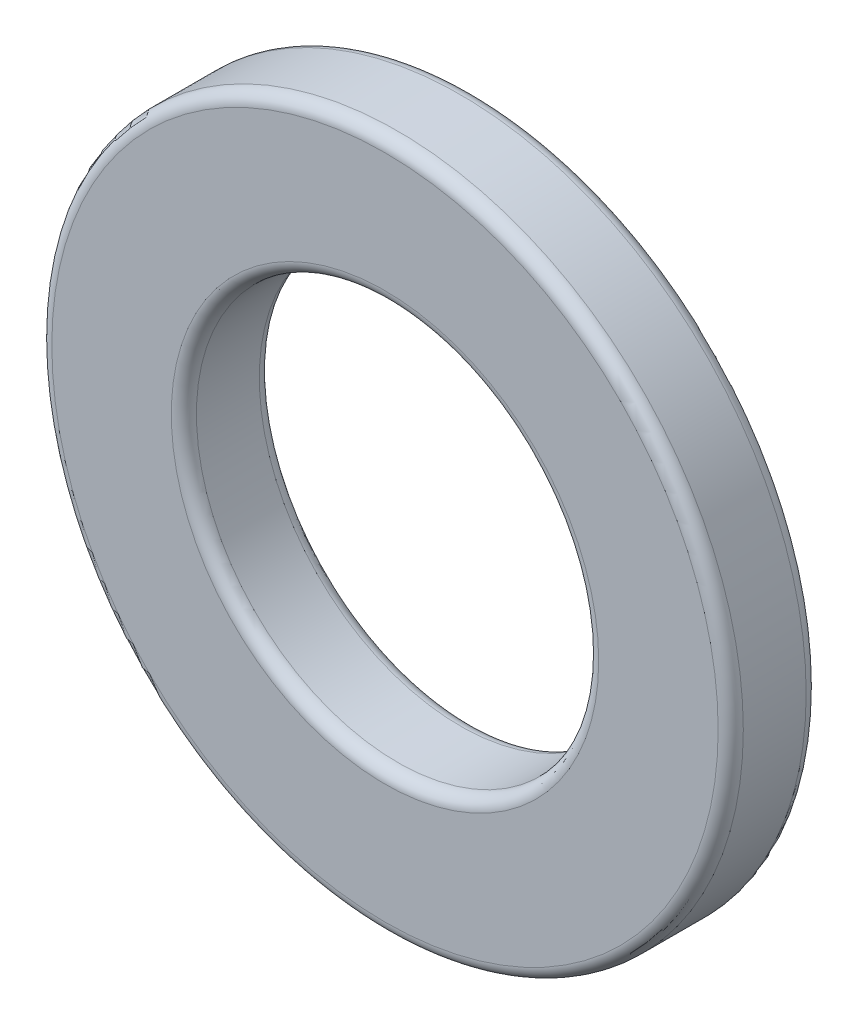
ISO-10303-21;
HEADER;
FILE_DESCRIPTION(('STEP AP214'),'2;1');
FILE_NAME('part.step','',(''),(''),'','','');
FILE_SCHEMA(('AUTOMOTIVE_DESIGN { 1 0 10303 214 1 1 1 1 }'));
ENDSEC;
DATA;
#1=APPLICATION_CONTEXT('core data for automotive mechanical design processes');
#2=APPLICATION_PROTOCOL_DEFINITION('international standard','automotive_design',2000,#1);
#3=PRODUCT_CONTEXT('',#1,'mechanical');
#4=PRODUCT('Part','Part','',(#3));
#5=PRODUCT_RELATED_PRODUCT_CATEGORY('part','',(#4));
#6=PRODUCT_DEFINITION_FORMATION('','',#4);
#7=PRODUCT_DEFINITION_CONTEXT('part definition',#1,'design');
#8=PRODUCT_DEFINITION('design','',#6,#7);
#9=PRODUCT_DEFINITION_SHAPE('','',#8);
#10=(LENGTH_UNIT() NAMED_UNIT(*) SI_UNIT(.MILLI.,.METRE.));
#11=(NAMED_UNIT(*) PLANE_ANGLE_UNIT() SI_UNIT($,.RADIAN.));
#12=(NAMED_UNIT(*) SI_UNIT($,.STERADIAN.) SOLID_ANGLE_UNIT());
#13=UNCERTAINTY_MEASURE_WITH_UNIT(LENGTH_MEASURE(1.E-05),#10,'distance_accuracy_value','');
#14=(GEOMETRIC_REPRESENTATION_CONTEXT(3) GLOBAL_UNCERTAINTY_ASSIGNED_CONTEXT((#13)) GLOBAL_UNIT_ASSIGNED_CONTEXT((#10,
#11,#12)) REPRESENTATION_CONTEXT('',''));
#15=CARTESIAN_POINT('',(0.,0.,0.));
#16=DIRECTION('',(0.,0.,1.));
#17=DIRECTION('',(1.,0.,0.));
#18=AXIS2_PLACEMENT_3D('',#15,#16,#17);
#19=CARTESIAN_POINT('',(0.,0.,0.35));
#20=DIRECTION('',(0.,0.,1.));
#21=DIRECTION('',(1.,0.,0.));
#22=AXIS2_PLACEMENT_3D('',#19,#20,#21);
#23=PLANE('',#22);
#24=CARTESIAN_POINT('',(0.,0.,0.35));
#25=DIRECTION('',(0.,0.,1.));
#26=DIRECTION('',(1.,0.,0.));
#27=AXIS2_PLACEMENT_3D('',#24,#25,#26);
#28=CIRCLE('',#27,0.85);
#29=CARTESIAN_POINT('',(0.85,0.,0.35));
#30=VERTEX_POINT('',#29);
#31=EDGE_CURVE('E51',#30,#30,#28,.F.);
#32=ORIENTED_EDGE('',*,*,#31,.T.);
#33=EDGE_LOOP('',(#32));
#34=FACE_BOUND('',#33,.T.);
#35=CARTESIAN_POINT('',(0.,0.,0.35));
#36=DIRECTION('',(0.,0.,1.));
#37=DIRECTION('',(1.,0.,0.));
#38=AXIS2_PLACEMENT_3D('',#35,#36,#37);
#39=CIRCLE('',#38,1.325);
#40=CARTESIAN_POINT('',(1.325,0.,0.35));
#41=VERTEX_POINT('',#40);
#42=EDGE_CURVE('E54',#41,#41,#39,.T.);
#43=ORIENTED_EDGE('',*,*,#42,.T.);
#44=EDGE_LOOP('',(#43));
#45=FACE_BOUND('',#44,.T.);
#46=ADVANCED_FACE('F31',(#34,#45),#23,.T.);
#47=CARTESIAN_POINT('',(0.,0.,0.));
#48=DIRECTION('',(0.,0.,1.));
#49=DIRECTION('',(1.,0.,0.));
#50=AXIS2_PLACEMENT_3D('',#47,#48,#49);
#51=PLANE('',#50);
#52=CARTESIAN_POINT('',(0.,0.,0.));
#53=DIRECTION('',(0.,0.,1.));
#54=DIRECTION('',(1.,0.,0.));
#55=AXIS2_PLACEMENT_3D('',#52,#53,#54);
#56=CIRCLE('',#55,0.85);
#57=CARTESIAN_POINT('',(0.85,0.,0.));
#58=VERTEX_POINT('',#57);
#59=EDGE_CURVE('E10',#58,#58,#56,.T.);
#60=ORIENTED_EDGE('',*,*,#59,.T.);
#61=EDGE_LOOP('',(#60));
#62=FACE_BOUND('',#61,.T.);
#63=CARTESIAN_POINT('',(0.,0.,0.));
#64=DIRECTION('',(0.,0.,1.));
#65=DIRECTION('',(1.,0.,0.));
#66=AXIS2_PLACEMENT_3D('',#63,#64,#65);
#67=CIRCLE('',#66,1.325);
#68=CARTESIAN_POINT('',(1.325,0.,0.));
#69=VERTEX_POINT('',#68);
#70=EDGE_CURVE('E38',#69,#69,#67,.F.);
#71=ORIENTED_EDGE('',*,*,#70,.T.);
#72=EDGE_LOOP('',(#71));
#73=FACE_BOUND('',#72,.T.);
#74=ADVANCED_FACE('F79',(#62,#73),#51,.F.);
#75=CARTESIAN_POINT('',(0.,0.,0.35));
#76=DIRECTION('',(0.,0.,-1.));
#77=DIRECTION('',(-1.,0.,0.));
#78=AXIS2_PLACEMENT_3D('',#75,#76,#77);
#79=CYLINDRICAL_SURFACE('',#78,1.375);
#80=CARTESIAN_POINT('',(0.,0.,0.3));
#81=DIRECTION('',(0.,0.,1.));
#82=DIRECTION('',(1.,0.,0.));
#83=AXIS2_PLACEMENT_3D('',#80,#81,#82);
#84=CIRCLE('',#83,1.375);
#85=CARTESIAN_POINT('',(1.375,0.,0.3));
#86=VERTEX_POINT('',#85);
#87=EDGE_CURVE('E42',#86,#86,#84,.F.);
#88=ORIENTED_EDGE('',*,*,#87,.T.);
#89=EDGE_LOOP('',(#88));
#90=FACE_BOUND('',#89,.T.);
#91=CARTESIAN_POINT('',(0.,0.,0.05));
#92=DIRECTION('',(0.,0.,1.));
#93=DIRECTION('',(1.,0.,0.));
#94=AXIS2_PLACEMENT_3D('',#91,#92,#93);
#95=CIRCLE('',#94,1.375);
#96=CARTESIAN_POINT('',(1.375,0.,0.05));
#97=VERTEX_POINT('',#96);
#98=EDGE_CURVE('E46',#97,#97,#95,.T.);
#99=ORIENTED_EDGE('',*,*,#98,.T.);
#100=EDGE_LOOP('',(#99));
#101=FACE_BOUND('',#100,.T.);
#102=ADVANCED_FACE('F85',(#90,#101),#79,.T.);
#103=CARTESIAN_POINT('',(0.,0.,0.35));
#104=DIRECTION('',(0.,0.,-1.));
#105=DIRECTION('',(-1.,0.,0.));
#106=AXIS2_PLACEMENT_3D('',#103,#104,#105);
#107=CYLINDRICAL_SURFACE('',#106,0.8);
#108=CARTESIAN_POINT('',(0.,0.,0.3));
#109=DIRECTION('',(0.,0.,1.));
#110=DIRECTION('',(1.,0.,0.));
#111=AXIS2_PLACEMENT_3D('',#108,#109,#110);
#112=CIRCLE('',#111,0.8);
#113=CARTESIAN_POINT('',(0.8,0.,0.3));
#114=VERTEX_POINT('',#113);
#115=EDGE_CURVE('E57',#114,#114,#112,.T.);
#116=ORIENTED_EDGE('',*,*,#115,.T.);
#117=EDGE_LOOP('',(#116));
#118=FACE_BOUND('',#117,.T.);
#119=CARTESIAN_POINT('',(0.,0.,0.05));
#120=DIRECTION('',(0.,0.,1.));
#121=DIRECTION('',(1.,0.,0.));
#122=AXIS2_PLACEMENT_3D('',#119,#120,#121);
#123=CIRCLE('',#122,0.8);
#124=CARTESIAN_POINT('',(0.8,0.,0.05));
#125=VERTEX_POINT('',#124);
#126=EDGE_CURVE('E60',#125,#125,#123,.F.);
#127=ORIENTED_EDGE('',*,*,#126,.T.);
#128=EDGE_LOOP('',(#127));
#129=FACE_BOUND('',#128,.T.);
#130=ADVANCED_FACE('F64',(#118,#129),#107,.F.);
#131=CARTESIAN_POINT('',(0.,0.,0.3));
#132=DIRECTION('',(0.,0.,1.));
#133=DIRECTION('',(1.,0.,0.));
#134=AXIS2_PLACEMENT_3D('',#131,#132,#133);
#135=TOROIDAL_SURFACE('',#134,0.85,0.05);
#136=ORIENTED_EDGE('',*,*,#31,.F.);
#137=EDGE_LOOP('',(#136));
#138=FACE_BOUND('',#137,.T.);
#139=ORIENTED_EDGE('',*,*,#115,.F.);
#140=EDGE_LOOP('',(#139));
#141=FACE_BOUND('',#140,.T.);
#142=ADVANCED_FACE('F75',(#138,#141),#135,.T.);
#143=CARTESIAN_POINT('',(0.,0.,0.3));
#144=DIRECTION('',(0.,0.,1.));
#145=DIRECTION('',(1.,0.,0.));
#146=AXIS2_PLACEMENT_3D('',#143,#144,#145);
#147=TOROIDAL_SURFACE('',#146,1.325,0.05);
#148=ORIENTED_EDGE('',*,*,#87,.F.);
#149=EDGE_LOOP('',(#148));
#150=FACE_BOUND('',#149,.T.);
#151=ORIENTED_EDGE('',*,*,#42,.F.);
#152=EDGE_LOOP('',(#151));
#153=FACE_BOUND('',#152,.T.);
#154=ADVANCED_FACE('F69',(#150,#153),#147,.T.);
#155=CARTESIAN_POINT('',(0.,0.,0.05));
#156=DIRECTION('',(0.,0.,1.));
#157=DIRECTION('',(1.,0.,0.));
#158=AXIS2_PLACEMENT_3D('',#155,#156,#157);
#159=TOROIDAL_SURFACE('',#158,0.85,0.05);
#160=ORIENTED_EDGE('',*,*,#126,.F.);
#161=EDGE_LOOP('',(#160));
#162=FACE_BOUND('',#161,.T.);
#163=ORIENTED_EDGE('',*,*,#59,.F.);
#164=EDGE_LOOP('',(#163));
#165=FACE_BOUND('',#164,.T.);
#166=ADVANCED_FACE('F66',(#162,#165),#159,.T.);
#167=CARTESIAN_POINT('',(0.,0.,0.05));
#168=DIRECTION('',(0.,0.,1.));
#169=DIRECTION('',(1.,0.,0.));
#170=AXIS2_PLACEMENT_3D('',#167,#168,#169);
#171=TOROIDAL_SURFACE('',#170,1.325,0.05);
#172=ORIENTED_EDGE('',*,*,#70,.F.);
#173=EDGE_LOOP('',(#172));
#174=FACE_BOUND('',#173,.T.);
#175=ORIENTED_EDGE('',*,*,#98,.F.);
#176=EDGE_LOOP('',(#175));
#177=FACE_BOUND('',#176,.T.);
#178=ADVANCED_FACE('F33',(#174,#177),#171,.T.);
#179=CLOSED_SHELL('',(#46,#74,#102,#130,#142,#154,#166,#178));
#180=MANIFOLD_SOLID_BREP('B2',#179);
#181=ADVANCED_BREP_SHAPE_REPRESENTATION('',(#18,#180),#14);
#182=SHAPE_DEFINITION_REPRESENTATION(#9,#181);
ENDSEC;
END-ISO-10303-21;
